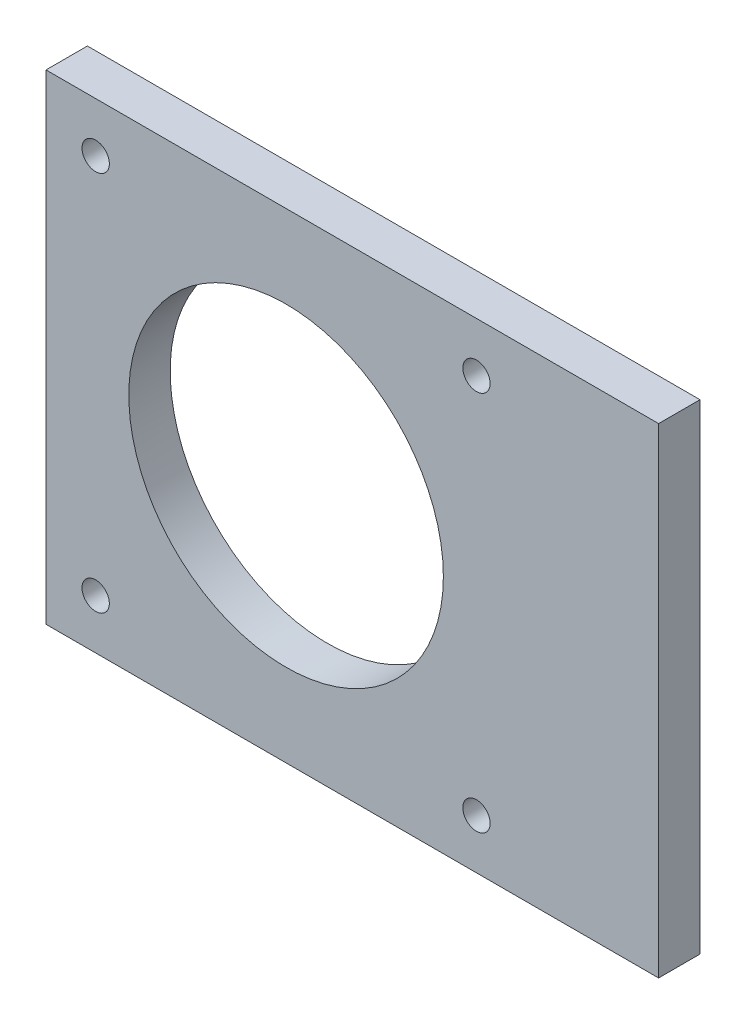
ISO-10303-21;
HEADER;
FILE_DESCRIPTION(('STEP AP214'),'2;1');
FILE_NAME('part.step','',(''),(''),'','','');
FILE_SCHEMA(('AUTOMOTIVE_DESIGN { 1 0 10303 214 1 1 1 1 }'));
ENDSEC;
DATA;
#1=APPLICATION_CONTEXT('core data for automotive mechanical design processes');
#2=APPLICATION_PROTOCOL_DEFINITION('international standard','automotive_design',2000,#1);
#3=PRODUCT_CONTEXT('',#1,'mechanical');
#4=PRODUCT('Part','Part','',(#3));
#5=PRODUCT_RELATED_PRODUCT_CATEGORY('part','',(#4));
#6=PRODUCT_DEFINITION_FORMATION('','',#4);
#7=PRODUCT_DEFINITION_CONTEXT('part definition',#1,'design');
#8=PRODUCT_DEFINITION('design','',#6,#7);
#9=PRODUCT_DEFINITION_SHAPE('','',#8);
#10=(LENGTH_UNIT() NAMED_UNIT(*) SI_UNIT(.MILLI.,.METRE.));
#11=(NAMED_UNIT(*) PLANE_ANGLE_UNIT() SI_UNIT($,.RADIAN.));
#12=(NAMED_UNIT(*) SI_UNIT($,.STERADIAN.) SOLID_ANGLE_UNIT());
#13=UNCERTAINTY_MEASURE_WITH_UNIT(LENGTH_MEASURE(1.E-05),#10,'distance_accuracy_value','');
#14=(GEOMETRIC_REPRESENTATION_CONTEXT(3) GLOBAL_UNCERTAINTY_ASSIGNED_CONTEXT((#13)) GLOBAL_UNIT_ASSIGNED_CONTEXT((#10,
#11,#12)) REPRESENTATION_CONTEXT('',''));
#15=CARTESIAN_POINT('',(0.,0.,0.));
#16=DIRECTION('',(0.,0.,1.));
#17=DIRECTION('',(1.,0.,0.));
#18=AXIS2_PLACEMENT_3D('',#15,#16,#17);
#19=CARTESIAN_POINT('',(45.,29.,5.));
#20=DIRECTION('',(-1.,0.,0.));
#21=DIRECTION('',(0.,-1.,0.));
#22=AXIS2_PLACEMENT_3D('',#19,#20,#21);
#23=PLANE('',#22);
#24=DIRECTION('',(0.,1.,0.));
#25=VECTOR('',#24,1.);
#26=CARTESIAN_POINT('',(45.,29.,0.));
#27=LINE('',#26,#25);
#28=CARTESIAN_POINT('',(45.,-29.,0.));
#29=VERTEX_POINT('',#28);
#30=CARTESIAN_POINT('',(45.,29.,0.));
#31=VERTEX_POINT('',#30);
#32=EDGE_CURVE('E89',#29,#31,#27,.T.);
#33=ORIENTED_EDGE('',*,*,#32,.T.);
#34=DIRECTION('',(0.,0.,-1.));
#35=VECTOR('',#34,1.);
#36=CARTESIAN_POINT('',(45.,29.,5.));
#37=LINE('',#36,#35);
#38=CARTESIAN_POINT('',(45.,29.,5.));
#39=VERTEX_POINT('',#38);
#40=EDGE_CURVE('E43',#39,#31,#37,.T.);
#41=ORIENTED_EDGE('',*,*,#40,.F.);
#42=DIRECTION('',(0.,1.,0.));
#43=VECTOR('',#42,1.);
#44=CARTESIAN_POINT('',(45.,29.,5.));
#45=LINE('',#44,#43);
#46=CARTESIAN_POINT('',(45.,-29.,5.));
#47=VERTEX_POINT('',#46);
#48=EDGE_CURVE('E81',#47,#39,#45,.T.);
#49=ORIENTED_EDGE('',*,*,#48,.F.);
#50=DIRECTION('',(0.,0.,-1.));
#51=VECTOR('',#50,1.);
#52=CARTESIAN_POINT('',(45.,-29.,5.));
#53=LINE('',#52,#51);
#54=EDGE_CURVE('E11',#47,#29,#53,.T.);
#55=ORIENTED_EDGE('',*,*,#54,.T.);
#56=EDGE_LOOP('',(#33,#41,#49,#55));
#57=FACE_BOUND('',#56,.T.);
#58=ADVANCED_FACE('F35',(#57),#23,.F.);
#59=CARTESIAN_POINT('',(-29.,29.,5.));
#60=DIRECTION('',(0.,-1.,0.));
#61=DIRECTION('',(0.,0.,-1.));
#62=AXIS2_PLACEMENT_3D('',#59,#60,#61);
#63=PLANE('',#62);
#64=DIRECTION('',(-1.,0.,0.));
#65=VECTOR('',#64,1.);
#66=CARTESIAN_POINT('',(-29.,29.,0.));
#67=LINE('',#66,#65);
#68=CARTESIAN_POINT('',(-29.,29.,0.));
#69=VERTEX_POINT('',#68);
#70=EDGE_CURVE('E68',#31,#69,#67,.T.);
#71=ORIENTED_EDGE('',*,*,#70,.T.);
#72=DIRECTION('',(0.,0.,-1.));
#73=VECTOR('',#72,1.);
#74=CARTESIAN_POINT('',(-29.,29.,5.));
#75=LINE('',#74,#73);
#76=CARTESIAN_POINT('',(-29.,29.,5.));
#77=VERTEX_POINT('',#76);
#78=EDGE_CURVE('E90',#77,#69,#75,.T.);
#79=ORIENTED_EDGE('',*,*,#78,.F.);
#80=DIRECTION('',(-1.,0.,0.));
#81=VECTOR('',#80,1.);
#82=CARTESIAN_POINT('',(29.,29.,5.));
#83=LINE('',#82,#81);
#84=EDGE_CURVE('E85',#39,#77,#83,.T.);
#85=ORIENTED_EDGE('',*,*,#84,.F.);
#86=ORIENTED_EDGE('',*,*,#40,.T.);
#87=EDGE_LOOP('',(#71,#79,#85,#86));
#88=FACE_BOUND('',#87,.T.);
#89=ADVANCED_FACE('F91',(#88),#63,.F.);
#90=CARTESIAN_POINT('',(-29.,29.,5.));
#91=DIRECTION('',(1.,0.,0.));
#92=DIRECTION('',(0.,1.,0.));
#93=AXIS2_PLACEMENT_3D('',#90,#91,#92);
#94=PLANE('',#93);
#95=DIRECTION('',(0.,-1.,0.));
#96=VECTOR('',#95,1.);
#97=CARTESIAN_POINT('',(-29.,29.,0.));
#98=LINE('',#97,#96);
#99=CARTESIAN_POINT('',(-29.,-29.,0.));
#100=VERTEX_POINT('',#99);
#101=EDGE_CURVE('E75',#69,#100,#98,.T.);
#102=ORIENTED_EDGE('',*,*,#101,.T.);
#103=DIRECTION('',(0.,0.,-1.));
#104=VECTOR('',#103,1.);
#105=CARTESIAN_POINT('',(-29.,-29.,5.));
#106=LINE('',#105,#104);
#107=CARTESIAN_POINT('',(-29.,-29.,5.));
#108=VERTEX_POINT('',#107);
#109=EDGE_CURVE('E95',#108,#100,#106,.T.);
#110=ORIENTED_EDGE('',*,*,#109,.F.);
#111=DIRECTION('',(0.,-1.,0.));
#112=VECTOR('',#111,1.);
#113=CARTESIAN_POINT('',(-29.,29.,5.));
#114=LINE('',#113,#112);
#115=EDGE_CURVE('E93',#77,#108,#114,.T.);
#116=ORIENTED_EDGE('',*,*,#115,.F.);
#117=ORIENTED_EDGE('',*,*,#78,.T.);
#118=EDGE_LOOP('',(#102,#110,#116,#117));
#119=FACE_BOUND('',#118,.T.);
#120=ADVANCED_FACE('F106',(#119),#94,.F.);
#121=CARTESIAN_POINT('',(-29.,-29.,5.));
#122=DIRECTION('',(0.,1.,0.));
#123=DIRECTION('',(0.,0.,1.));
#124=AXIS2_PLACEMENT_3D('',#121,#122,#123);
#125=PLANE('',#124);
#126=DIRECTION('',(1.,0.,0.));
#127=VECTOR('',#126,1.);
#128=CARTESIAN_POINT('',(-29.,-29.,0.));
#129=LINE('',#128,#127);
#130=EDGE_CURVE('E103',#100,#29,#129,.T.);
#131=ORIENTED_EDGE('',*,*,#130,.T.);
#132=ORIENTED_EDGE('',*,*,#54,.F.);
#133=DIRECTION('',(1.,0.,0.));
#134=VECTOR('',#133,1.);
#135=CARTESIAN_POINT('',(45.,-29.,5.));
#136=LINE('',#135,#134);
#137=EDGE_CURVE('E51',#108,#47,#136,.T.);
#138=ORIENTED_EDGE('',*,*,#137,.F.);
#139=ORIENTED_EDGE('',*,*,#109,.T.);
#140=EDGE_LOOP('',(#131,#132,#138,#139));
#141=FACE_BOUND('',#140,.T.);
#142=ADVANCED_FACE('F110',(#141),#125,.F.);
#143=CARTESIAN_POINT('',(0.,0.,5.));
#144=DIRECTION('',(0.,0.,1.));
#145=DIRECTION('',(1.,0.,0.));
#146=AXIS2_PLACEMENT_3D('',#143,#144,#145);
#147=PLANE('',#146);
#148=CARTESIAN_POINT('',(0.,0.,5.));
#149=DIRECTION('',(0.,0.,1.));
#150=DIRECTION('',(1.,0.,0.));
#151=AXIS2_PLACEMENT_3D('',#148,#149,#150);
#152=CIRCLE('',#151,19.);
#153=CARTESIAN_POINT('',(19.,0.,5.));
#154=VERTEX_POINT('',#153);
#155=EDGE_CURVE('E210',#154,#154,#152,.T.);
#156=ORIENTED_EDGE('',*,*,#155,.F.);
#157=EDGE_LOOP('',(#156));
#158=FACE_BOUND('',#157,.T.);
#159=CARTESIAN_POINT('',(-23.,-23.,5.));
#160=DIRECTION('',(0.,0.,1.));
#161=DIRECTION('',(1.,0.,0.));
#162=AXIS2_PLACEMENT_3D('',#159,#160,#161);
#163=CIRCLE('',#162,1.64999999999999);
#164=CARTESIAN_POINT('',(-21.35,-23.,5.));
#165=VERTEX_POINT('',#164);
#166=EDGE_CURVE('E212',#165,#165,#163,.T.);
#167=ORIENTED_EDGE('',*,*,#166,.F.);
#168=EDGE_LOOP('',(#167));
#169=FACE_BOUND('',#168,.T.);
#170=CARTESIAN_POINT('',(23.,-23.,5.));
#171=DIRECTION('',(0.,0.,1.));
#172=DIRECTION('',(1.,0.,0.));
#173=AXIS2_PLACEMENT_3D('',#170,#171,#172);
#174=CIRCLE('',#173,1.64999999999999);
#175=CARTESIAN_POINT('',(24.65,-23.,5.));
#176=VERTEX_POINT('',#175);
#177=EDGE_CURVE('E220',#176,#176,#174,.T.);
#178=ORIENTED_EDGE('',*,*,#177,.F.);
#179=EDGE_LOOP('',(#178));
#180=FACE_BOUND('',#179,.T.);
#181=CARTESIAN_POINT('',(-23.,23.,5.));
#182=DIRECTION('',(0.,0.,1.));
#183=DIRECTION('',(1.,0.,0.));
#184=AXIS2_PLACEMENT_3D('',#181,#182,#183);
#185=CIRCLE('',#184,1.64999999999999);
#186=CARTESIAN_POINT('',(-21.35,23.,5.));
#187=VERTEX_POINT('',#186);
#188=EDGE_CURVE('E226',#187,#187,#185,.T.);
#189=ORIENTED_EDGE('',*,*,#188,.F.);
#190=EDGE_LOOP('',(#189));
#191=FACE_BOUND('',#190,.T.);
#192=CARTESIAN_POINT('',(23.,23.,5.));
#193=DIRECTION('',(0.,0.,1.));
#194=DIRECTION('',(1.,0.,0.));
#195=AXIS2_PLACEMENT_3D('',#192,#193,#194);
#196=CIRCLE('',#195,1.64999999999999);
#197=CARTESIAN_POINT('',(24.65,23.,5.));
#198=VERTEX_POINT('',#197);
#199=EDGE_CURVE('E232',#198,#198,#196,.T.);
#200=ORIENTED_EDGE('',*,*,#199,.F.);
#201=EDGE_LOOP('',(#200));
#202=FACE_BOUND('',#201,.T.);
#203=ORIENTED_EDGE('',*,*,#137,.T.);
#204=ORIENTED_EDGE('',*,*,#48,.T.);
#205=ORIENTED_EDGE('',*,*,#84,.T.);
#206=ORIENTED_EDGE('',*,*,#115,.T.);
#207=EDGE_LOOP('',(#203,#204,#205,#206));
#208=FACE_BOUND('',#207,.T.);
#209=ADVANCED_FACE('F83',(#158,#169,#180,#191,#202,#208),#147,.T.);
#210=CARTESIAN_POINT('',(0.,0.,0.));
#211=DIRECTION('',(0.,0.,1.));
#212=DIRECTION('',(1.,0.,0.));
#213=AXIS2_PLACEMENT_3D('',#210,#211,#212);
#214=PLANE('',#213);
#215=CARTESIAN_POINT('',(0.,0.,0.));
#216=DIRECTION('',(0.,0.,1.));
#217=DIRECTION('',(1.,0.,0.));
#218=AXIS2_PLACEMENT_3D('',#215,#216,#217);
#219=CIRCLE('',#218,19.);
#220=CARTESIAN_POINT('',(19.,0.,0.));
#221=VERTEX_POINT('',#220);
#222=EDGE_CURVE('E207',#221,#221,#219,.T.);
#223=ORIENTED_EDGE('',*,*,#222,.T.);
#224=EDGE_LOOP('',(#223));
#225=FACE_BOUND('',#224,.T.);
#226=CARTESIAN_POINT('',(-23.,-23.,0.));
#227=DIRECTION('',(0.,0.,1.));
#228=DIRECTION('',(1.,0.,0.));
#229=AXIS2_PLACEMENT_3D('',#226,#227,#228);
#230=CIRCLE('',#229,1.64999999999999);
#231=CARTESIAN_POINT('',(-21.35,-23.,0.));
#232=VERTEX_POINT('',#231);
#233=EDGE_CURVE('E217',#232,#232,#230,.T.);
#234=ORIENTED_EDGE('',*,*,#233,.T.);
#235=EDGE_LOOP('',(#234));
#236=FACE_BOUND('',#235,.T.);
#237=CARTESIAN_POINT('',(23.,-23.,0.));
#238=DIRECTION('',(0.,0.,1.));
#239=DIRECTION('',(1.,0.,0.));
#240=AXIS2_PLACEMENT_3D('',#237,#238,#239);
#241=CIRCLE('',#240,1.64999999999999);
#242=CARTESIAN_POINT('',(24.65,-23.,0.));
#243=VERTEX_POINT('',#242);
#244=EDGE_CURVE('E223',#243,#243,#241,.T.);
#245=ORIENTED_EDGE('',*,*,#244,.T.);
#246=EDGE_LOOP('',(#245));
#247=FACE_BOUND('',#246,.T.);
#248=CARTESIAN_POINT('',(-23.,23.,0.));
#249=DIRECTION('',(0.,0.,1.));
#250=DIRECTION('',(1.,0.,0.));
#251=AXIS2_PLACEMENT_3D('',#248,#249,#250);
#252=CIRCLE('',#251,1.64999999999999);
#253=CARTESIAN_POINT('',(-21.35,23.,0.));
#254=VERTEX_POINT('',#253);
#255=EDGE_CURVE('E229',#254,#254,#252,.T.);
#256=ORIENTED_EDGE('',*,*,#255,.T.);
#257=EDGE_LOOP('',(#256));
#258=FACE_BOUND('',#257,.T.);
#259=CARTESIAN_POINT('',(23.,23.,0.));
#260=DIRECTION('',(0.,0.,1.));
#261=DIRECTION('',(1.,0.,0.));
#262=AXIS2_PLACEMENT_3D('',#259,#260,#261);
#263=CIRCLE('',#262,1.64999999999999);
#264=CARTESIAN_POINT('',(24.65,23.,0.));
#265=VERTEX_POINT('',#264);
#266=EDGE_CURVE('E100',#265,#265,#263,.T.);
#267=ORIENTED_EDGE('',*,*,#266,.T.);
#268=EDGE_LOOP('',(#267));
#269=FACE_BOUND('',#268,.T.);
#270=ORIENTED_EDGE('',*,*,#32,.F.);
#271=ORIENTED_EDGE('',*,*,#130,.F.);
#272=ORIENTED_EDGE('',*,*,#101,.F.);
#273=ORIENTED_EDGE('',*,*,#70,.F.);
#274=EDGE_LOOP('',(#270,#271,#272,#273));
#275=FACE_BOUND('',#274,.T.);
#276=ADVANCED_FACE('F109',(#225,#236,#247,#258,#269,#275),#214,.F.);
#277=CARTESIAN_POINT('',(23.,23.,5.));
#278=DIRECTION('',(0.,0.,1.));
#279=DIRECTION('',(1.,0.,0.));
#280=AXIS2_PLACEMENT_3D('',#277,#278,#279);
#281=CYLINDRICAL_SURFACE('',#280,1.64999999999999);
#282=ORIENTED_EDGE('',*,*,#266,.F.);
#283=EDGE_LOOP('',(#282));
#284=FACE_BOUND('',#283,.T.);
#285=ORIENTED_EDGE('',*,*,#199,.T.);
#286=EDGE_LOOP('',(#285));
#287=FACE_BOUND('',#286,.T.);
#288=ADVANCED_FACE('F142',(#284,#287),#281,.F.);
#289=CARTESIAN_POINT('',(-23.,23.,5.));
#290=DIRECTION('',(0.,0.,1.));
#291=DIRECTION('',(1.,0.,0.));
#292=AXIS2_PLACEMENT_3D('',#289,#290,#291);
#293=CYLINDRICAL_SURFACE('',#292,1.64999999999999);
#294=ORIENTED_EDGE('',*,*,#255,.F.);
#295=EDGE_LOOP('',(#294));
#296=FACE_BOUND('',#295,.T.);
#297=ORIENTED_EDGE('',*,*,#188,.T.);
#298=EDGE_LOOP('',(#297));
#299=FACE_BOUND('',#298,.T.);
#300=ADVANCED_FACE('F147',(#296,#299),#293,.F.);
#301=CARTESIAN_POINT('',(23.,-23.,5.));
#302=DIRECTION('',(0.,0.,1.));
#303=DIRECTION('',(1.,0.,0.));
#304=AXIS2_PLACEMENT_3D('',#301,#302,#303);
#305=CYLINDRICAL_SURFACE('',#304,1.64999999999999);
#306=ORIENTED_EDGE('',*,*,#244,.F.);
#307=EDGE_LOOP('',(#306));
#308=FACE_BOUND('',#307,.T.);
#309=ORIENTED_EDGE('',*,*,#177,.T.);
#310=EDGE_LOOP('',(#309));
#311=FACE_BOUND('',#310,.T.);
#312=ADVANCED_FACE('F159',(#308,#311),#305,.F.);
#313=CARTESIAN_POINT('',(-23.,-23.,5.));
#314=DIRECTION('',(0.,0.,1.));
#315=DIRECTION('',(1.,0.,0.));
#316=AXIS2_PLACEMENT_3D('',#313,#314,#315);
#317=CYLINDRICAL_SURFACE('',#316,1.64999999999999);
#318=ORIENTED_EDGE('',*,*,#233,.F.);
#319=EDGE_LOOP('',(#318));
#320=FACE_BOUND('',#319,.T.);
#321=ORIENTED_EDGE('',*,*,#166,.T.);
#322=EDGE_LOOP('',(#321));
#323=FACE_BOUND('',#322,.T.);
#324=ADVANCED_FACE('F169',(#320,#323),#317,.F.);
#325=CARTESIAN_POINT('',(0.,0.,0.));
#326=DIRECTION('',(0.,0.,1.));
#327=DIRECTION('',(1.,0.,0.));
#328=AXIS2_PLACEMENT_3D('',#325,#326,#327);
#329=CYLINDRICAL_SURFACE('',#328,19.);
#330=ORIENTED_EDGE('',*,*,#222,.F.);
#331=EDGE_LOOP('',(#330));
#332=FACE_BOUND('',#331,.T.);
#333=ORIENTED_EDGE('',*,*,#155,.T.);
#334=EDGE_LOOP('',(#333));
#335=FACE_BOUND('',#334,.T.);
#336=ADVANCED_FACE('F179',(#332,#335),#329,.F.);
#337=CLOSED_SHELL('',(#58,#89,#120,#142,#209,#276,#288,#300,#312,#324,#336));
#338=MANIFOLD_SOLID_BREP('B2',#337);
#339=ADVANCED_BREP_SHAPE_REPRESENTATION('',(#18,#338),#14);
#340=SHAPE_DEFINITION_REPRESENTATION(#9,#339);
ENDSEC;
END-ISO-10303-21;
